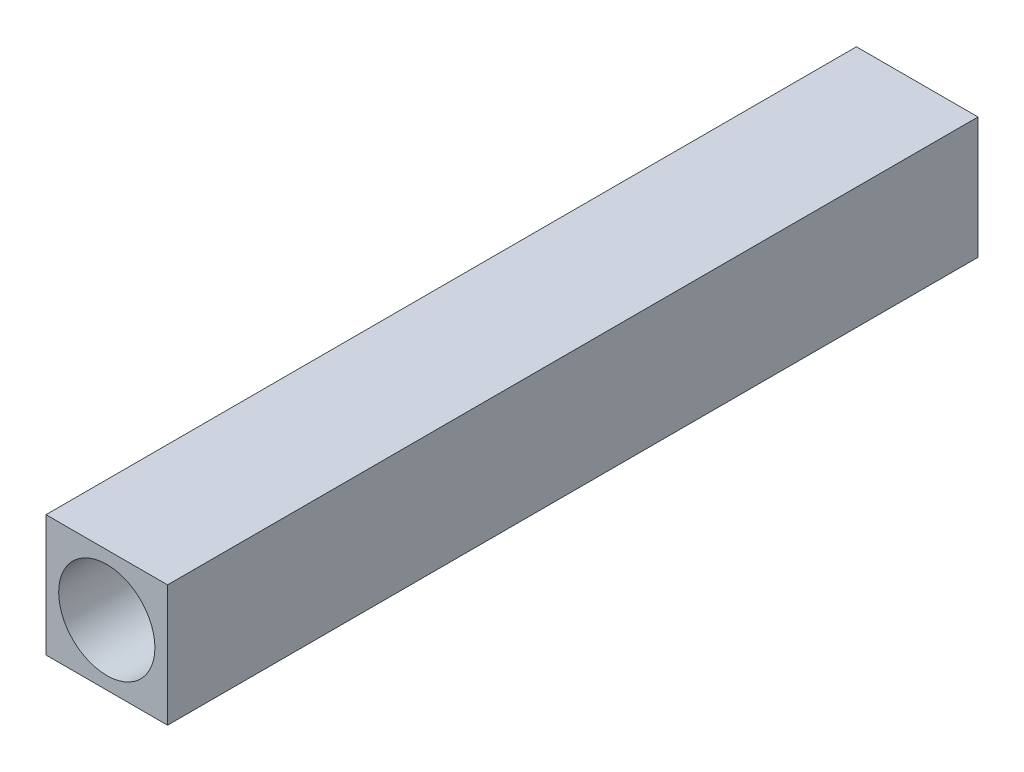
ISO-10303-21;
HEADER;
FILE_DESCRIPTION(('STEP AP214'),'2;1');
FILE_NAME('part.step','',(''),(''),'','','');
FILE_SCHEMA(('AUTOMOTIVE_DESIGN { 1 0 10303 214 1 1 1 1 }'));
ENDSEC;
DATA;
#1=APPLICATION_CONTEXT('core data for automotive mechanical design processes');
#2=APPLICATION_PROTOCOL_DEFINITION('international standard','automotive_design',2000,#1);
#3=PRODUCT_CONTEXT('',#1,'mechanical');
#4=PRODUCT('Part','Part','',(#3));
#5=PRODUCT_RELATED_PRODUCT_CATEGORY('part','',(#4));
#6=PRODUCT_DEFINITION_FORMATION('','',#4);
#7=PRODUCT_DEFINITION_CONTEXT('part definition',#1,'design');
#8=PRODUCT_DEFINITION('design','',#6,#7);
#9=PRODUCT_DEFINITION_SHAPE('','',#8);
#10=(LENGTH_UNIT() NAMED_UNIT(*) SI_UNIT(.MILLI.,.METRE.));
#11=(NAMED_UNIT(*) PLANE_ANGLE_UNIT() SI_UNIT($,.RADIAN.));
#12=(NAMED_UNIT(*) SI_UNIT($,.STERADIAN.) SOLID_ANGLE_UNIT());
#13=UNCERTAINTY_MEASURE_WITH_UNIT(LENGTH_MEASURE(1.E-05),#10,'distance_accuracy_value','');
#14=(GEOMETRIC_REPRESENTATION_CONTEXT(3) GLOBAL_UNCERTAINTY_ASSIGNED_CONTEXT((#13)) GLOBAL_UNIT_ASSIGNED_CONTEXT((#10,
#11,#12)) REPRESENTATION_CONTEXT('',''));
#15=CARTESIAN_POINT('',(0.,0.,0.));
#16=DIRECTION('',(0.,0.,1.));
#17=DIRECTION('',(1.,0.,0.));
#18=AXIS2_PLACEMENT_3D('',#15,#16,#17);
#19=CARTESIAN_POINT('',(0.,0.,162.56));
#20=DIRECTION('',(0.,0.,-1.));
#21=DIRECTION('',(-1.,0.,0.));
#22=AXIS2_PLACEMENT_3D('',#19,#20,#21);
#23=CYLINDRICAL_SURFACE('',#22,9.652);
#24=CARTESIAN_POINT('',(0.,0.,162.56));
#25=DIRECTION('',(0.,0.,1.));
#26=DIRECTION('',(1.,0.,0.));
#27=AXIS2_PLACEMENT_3D('',#24,#25,#26);
#28=CIRCLE('',#27,9.652);
#29=CARTESIAN_POINT('',(9.652,0.,162.56));
#30=VERTEX_POINT('',#29);
#31=EDGE_CURVE('E11',#30,#30,#28,.T.);
#32=ORIENTED_EDGE('',*,*,#31,.T.);
#33=EDGE_LOOP('',(#32));
#34=FACE_BOUND('',#33,.T.);
#35=CARTESIAN_POINT('',(0.,0.,6.35));
#36=DIRECTION('',(0.,0.,-1.));
#37=DIRECTION('',(-1.,0.,0.));
#38=AXIS2_PLACEMENT_3D('',#35,#36,#37);
#39=CIRCLE('',#38,9.652);
#40=CARTESIAN_POINT('',(-9.652,0.,6.35));
#41=VERTEX_POINT('',#40);
#42=EDGE_CURVE('E44',#41,#41,#39,.T.);
#43=ORIENTED_EDGE('',*,*,#42,.T.);
#44=EDGE_LOOP('',(#43));
#45=FACE_BOUND('',#44,.T.);
#46=ADVANCED_FACE('F35',(#34,#45),#23,.F.);
#47=CARTESIAN_POINT('',(0.,0.,162.56));
#48=DIRECTION('',(0.,0.,1.));
#49=DIRECTION('',(1.,0.,0.));
#50=AXIS2_PLACEMENT_3D('',#47,#48,#49);
#51=PLANE('',#50);
#52=DIRECTION('',(1.,0.,0.));
#53=VECTOR('',#52,1.);
#54=CARTESIAN_POINT('',(-12.192,-12.192,162.56));
#55=LINE('',#54,#53);
#56=CARTESIAN_POINT('',(-12.192,-12.192,162.56));
#57=VERTEX_POINT('',#56);
#58=CARTESIAN_POINT('',(12.192,-12.192,162.56));
#59=VERTEX_POINT('',#58);
#60=EDGE_CURVE('E106',#57,#59,#55,.T.);
#61=ORIENTED_EDGE('',*,*,#60,.T.);
#62=DIRECTION('',(0.,1.,0.));
#63=VECTOR('',#62,1.);
#64=CARTESIAN_POINT('',(12.192,12.192,162.56));
#65=LINE('',#64,#63);
#66=CARTESIAN_POINT('',(12.192,12.192,162.56));
#67=VERTEX_POINT('',#66);
#68=EDGE_CURVE('E69',#59,#67,#65,.T.);
#69=ORIENTED_EDGE('',*,*,#68,.T.);
#70=DIRECTION('',(-1.,0.,0.));
#71=VECTOR('',#70,1.);
#72=CARTESIAN_POINT('',(-12.192,12.192,162.56));
#73=LINE('',#72,#71);
#74=CARTESIAN_POINT('',(-12.192,12.192,162.56));
#75=VERTEX_POINT('',#74);
#76=EDGE_CURVE('E73',#67,#75,#73,.T.);
#77=ORIENTED_EDGE('',*,*,#76,.T.);
#78=DIRECTION('',(0.,-1.,0.));
#79=VECTOR('',#78,1.);
#80=CARTESIAN_POINT('',(-12.192,12.192,162.56));
#81=LINE('',#80,#79);
#82=EDGE_CURVE('E104',#75,#57,#81,.T.);
#83=ORIENTED_EDGE('',*,*,#82,.T.);
#84=EDGE_LOOP('',(#61,#69,#77,#83));
#85=FACE_BOUND('',#84,.T.);
#86=ORIENTED_EDGE('',*,*,#31,.F.);
#87=EDGE_LOOP('',(#86));
#88=FACE_BOUND('',#87,.T.);
#89=ADVANCED_FACE('F135',(#85,#88),#51,.T.);
#90=CARTESIAN_POINT('',(0.,0.,0.));
#91=DIRECTION('',(0.,0.,1.));
#92=DIRECTION('',(1.,0.,0.));
#93=AXIS2_PLACEMENT_3D('',#90,#91,#92);
#94=PLANE('',#93);
#95=DIRECTION('',(0.,-1.,0.));
#96=VECTOR('',#95,1.);
#97=CARTESIAN_POINT('',(-12.192,12.192,0.));
#98=LINE('',#97,#96);
#99=CARTESIAN_POINT('',(-12.192,12.192,0.));
#100=VERTEX_POINT('',#99);
#101=CARTESIAN_POINT('',(-12.192,-12.192,0.));
#102=VERTEX_POINT('',#101);
#103=EDGE_CURVE('E79',#100,#102,#98,.T.);
#104=ORIENTED_EDGE('',*,*,#103,.F.);
#105=DIRECTION('',(-1.,0.,0.));
#106=VECTOR('',#105,1.);
#107=CARTESIAN_POINT('',(-12.192,12.192,0.));
#108=LINE('',#107,#106);
#109=CARTESIAN_POINT('',(12.192,12.192,0.));
#110=VERTEX_POINT('',#109);
#111=EDGE_CURVE('E52',#110,#100,#108,.T.);
#112=ORIENTED_EDGE('',*,*,#111,.F.);
#113=DIRECTION('',(0.,1.,0.));
#114=VECTOR('',#113,1.);
#115=CARTESIAN_POINT('',(12.192,12.192,0.));
#116=LINE('',#115,#114);
#117=CARTESIAN_POINT('',(12.192,-12.192,0.));
#118=VERTEX_POINT('',#117);
#119=EDGE_CURVE('E93',#118,#110,#116,.T.);
#120=ORIENTED_EDGE('',*,*,#119,.F.);
#121=DIRECTION('',(1.,0.,0.));
#122=VECTOR('',#121,1.);
#123=CARTESIAN_POINT('',(-12.192,-12.192,0.));
#124=LINE('',#123,#122);
#125=EDGE_CURVE('E85',#102,#118,#124,.T.);
#126=ORIENTED_EDGE('',*,*,#125,.F.);
#127=EDGE_LOOP('',(#104,#112,#120,#126));
#128=FACE_BOUND('',#127,.T.);
#129=CARTESIAN_POINT('',(0.,0.,0.));
#130=DIRECTION('',(0.,0.,-1.));
#131=DIRECTION('',(-1.,0.,0.));
#132=AXIS2_PLACEMENT_3D('',#129,#130,#131);
#133=CIRCLE('',#132,8.636);
#134=CARTESIAN_POINT('',(-8.636,0.,0.));
#135=VERTEX_POINT('',#134);
#136=EDGE_CURVE('E112',#135,#135,#133,.T.);
#137=ORIENTED_EDGE('',*,*,#136,.F.);
#138=EDGE_LOOP('',(#137));
#139=FACE_BOUND('',#138,.T.);
#140=ADVANCED_FACE('F37',(#128,#139),#94,.F.);
#141=CARTESIAN_POINT('',(0.,0.,6.35));
#142=DIRECTION('',(0.,0.,-1.));
#143=DIRECTION('',(-1.,0.,0.));
#144=AXIS2_PLACEMENT_3D('',#141,#142,#143);
#145=PLANE('',#144);
#146=CARTESIAN_POINT('',(0.,0.,6.35));
#147=DIRECTION('',(0.,0.,-1.));
#148=DIRECTION('',(-1.,0.,0.));
#149=AXIS2_PLACEMENT_3D('',#146,#147,#148);
#150=CIRCLE('',#149,8.636);
#151=CARTESIAN_POINT('',(-8.636,0.,6.35));
#152=VERTEX_POINT('',#151);
#153=EDGE_CURVE('E115',#152,#152,#150,.T.);
#154=ORIENTED_EDGE('',*,*,#153,.T.);
#155=EDGE_LOOP('',(#154));
#156=FACE_BOUND('',#155,.T.);
#157=ORIENTED_EDGE('',*,*,#42,.F.);
#158=EDGE_LOOP('',(#157));
#159=FACE_BOUND('',#158,.T.);
#160=ADVANCED_FACE('F123',(#156,#159),#145,.F.);
#161=CARTESIAN_POINT('',(0.,0.,6.35));
#162=DIRECTION('',(0.,0.,-1.));
#163=DIRECTION('',(-1.,0.,0.));
#164=AXIS2_PLACEMENT_3D('',#161,#162,#163);
#165=CYLINDRICAL_SURFACE('',#164,8.636);
#166=ORIENTED_EDGE('',*,*,#153,.F.);
#167=EDGE_LOOP('',(#166));
#168=FACE_BOUND('',#167,.T.);
#169=ORIENTED_EDGE('',*,*,#136,.T.);
#170=EDGE_LOOP('',(#169));
#171=FACE_BOUND('',#170,.T.);
#172=ADVANCED_FACE('F125',(#168,#171),#165,.F.);
#173=CARTESIAN_POINT('',(-12.192,12.192,0.));
#174=DIRECTION('',(-1.,0.,0.));
#175=DIRECTION('',(0.,-1.,0.));
#176=AXIS2_PLACEMENT_3D('',#173,#174,#175);
#177=PLANE('',#176);
#178=ORIENTED_EDGE('',*,*,#103,.T.);
#179=DIRECTION('',(0.,0.,1.));
#180=VECTOR('',#179,1.);
#181=CARTESIAN_POINT('',(-12.192,-12.192,0.));
#182=LINE('',#181,#180);
#183=EDGE_CURVE('E90',#102,#57,#182,.T.);
#184=ORIENTED_EDGE('',*,*,#183,.T.);
#185=ORIENTED_EDGE('',*,*,#82,.F.);
#186=DIRECTION('',(0.,0.,1.));
#187=VECTOR('',#186,1.);
#188=CARTESIAN_POINT('',(-12.192,12.192,0.));
#189=LINE('',#188,#187);
#190=EDGE_CURVE('E110',#100,#75,#189,.T.);
#191=ORIENTED_EDGE('',*,*,#190,.F.);
#192=EDGE_LOOP('',(#178,#184,#185,#191));
#193=FACE_BOUND('',#192,.T.);
#194=ADVANCED_FACE('F132',(#193),#177,.T.);
#195=CARTESIAN_POINT('',(-12.192,12.192,0.));
#196=DIRECTION('',(0.,1.,0.));
#197=DIRECTION('',(0.,0.,1.));
#198=AXIS2_PLACEMENT_3D('',#195,#196,#197);
#199=PLANE('',#198);
#200=ORIENTED_EDGE('',*,*,#111,.T.);
#201=ORIENTED_EDGE('',*,*,#190,.T.);
#202=ORIENTED_EDGE('',*,*,#76,.F.);
#203=DIRECTION('',(0.,0.,1.));
#204=VECTOR('',#203,1.);
#205=CARTESIAN_POINT('',(12.192,12.192,0.));
#206=LINE('',#205,#204);
#207=EDGE_CURVE('E97',#110,#67,#206,.T.);
#208=ORIENTED_EDGE('',*,*,#207,.F.);
#209=EDGE_LOOP('',(#200,#201,#202,#208));
#210=FACE_BOUND('',#209,.T.);
#211=ADVANCED_FACE('F148',(#210),#199,.T.);
#212=CARTESIAN_POINT('',(12.192,12.192,0.));
#213=DIRECTION('',(1.,0.,0.));
#214=DIRECTION('',(0.,1.,0.));
#215=AXIS2_PLACEMENT_3D('',#212,#213,#214);
#216=PLANE('',#215);
#217=ORIENTED_EDGE('',*,*,#119,.T.);
#218=ORIENTED_EDGE('',*,*,#207,.T.);
#219=ORIENTED_EDGE('',*,*,#68,.F.);
#220=DIRECTION('',(0.,0.,1.));
#221=VECTOR('',#220,1.);
#222=CARTESIAN_POINT('',(12.192,-12.192,0.));
#223=LINE('',#222,#221);
#224=EDGE_CURVE('E89',#118,#59,#223,.T.);
#225=ORIENTED_EDGE('',*,*,#224,.F.);
#226=EDGE_LOOP('',(#217,#218,#219,#225));
#227=FACE_BOUND('',#226,.T.);
#228=ADVANCED_FACE('F96',(#227),#216,.T.);
#229=CARTESIAN_POINT('',(-12.192,-12.192,0.));
#230=DIRECTION('',(0.,-1.,0.));
#231=DIRECTION('',(0.,0.,-1.));
#232=AXIS2_PLACEMENT_3D('',#229,#230,#231);
#233=PLANE('',#232);
#234=ORIENTED_EDGE('',*,*,#125,.T.);
#235=ORIENTED_EDGE('',*,*,#224,.T.);
#236=ORIENTED_EDGE('',*,*,#60,.F.);
#237=ORIENTED_EDGE('',*,*,#183,.F.);
#238=EDGE_LOOP('',(#234,#235,#236,#237));
#239=FACE_BOUND('',#238,.T.);
#240=ADVANCED_FACE('F87',(#239),#233,.T.);
#241=CLOSED_SHELL('',(#46,#89,#140,#160,#172,#194,#211,#228,#240));
#242=MANIFOLD_SOLID_BREP('B2',#241);
#243=ADVANCED_BREP_SHAPE_REPRESENTATION('',(#18,#242),#14);
#244=SHAPE_DEFINITION_REPRESENTATION(#9,#243);
ENDSEC;
END-ISO-10303-21;
